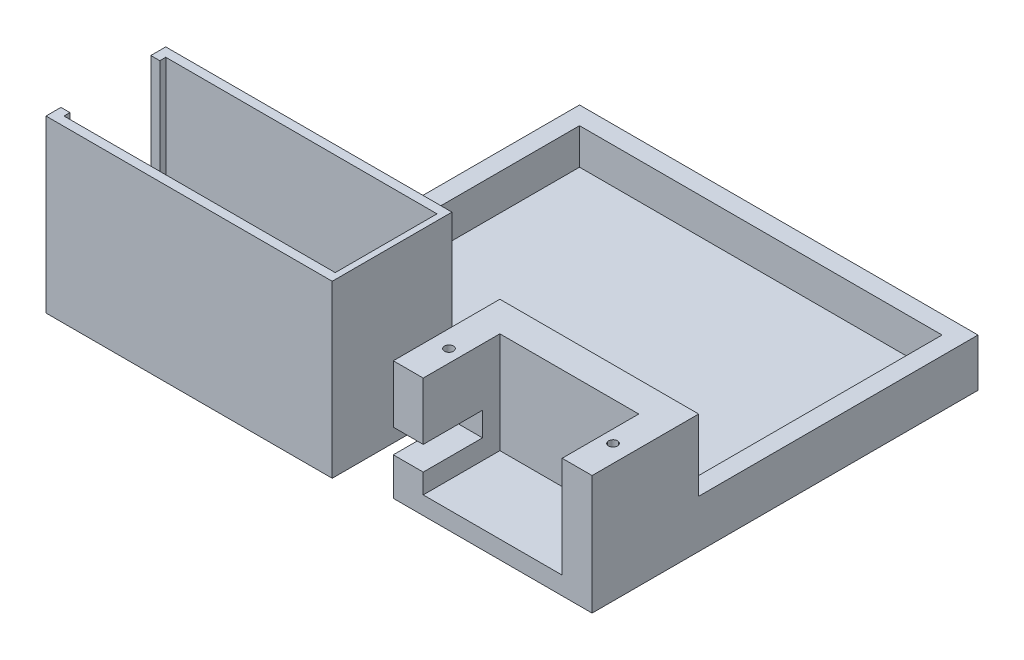
ISO-10303-21;
HEADER;
FILE_DESCRIPTION(('STEP AP214'),'2;1');
FILE_NAME('part.step','',(''),(''),'','','');
FILE_SCHEMA(('AUTOMOTIVE_DESIGN { 1 0 10303 214 1 1 1 1 }'));
ENDSEC;
DATA;
#1=APPLICATION_CONTEXT('core data for automotive mechanical design processes');
#2=APPLICATION_PROTOCOL_DEFINITION('international standard','automotive_design',2000,#1);
#3=PRODUCT_CONTEXT('',#1,'mechanical');
#4=PRODUCT('Part','Part','',(#3));
#5=PRODUCT_RELATED_PRODUCT_CATEGORY('part','',(#4));
#6=PRODUCT_DEFINITION_FORMATION('','',#4);
#7=PRODUCT_DEFINITION_CONTEXT('part definition',#1,'design');
#8=PRODUCT_DEFINITION('design','',#6,#7);
#9=PRODUCT_DEFINITION_SHAPE('','',#8);
#10=(LENGTH_UNIT() NAMED_UNIT(*) SI_UNIT(.MILLI.,.METRE.));
#11=(NAMED_UNIT(*) PLANE_ANGLE_UNIT() SI_UNIT($,.RADIAN.));
#12=(NAMED_UNIT(*) SI_UNIT($,.STERADIAN.) SOLID_ANGLE_UNIT());
#13=UNCERTAINTY_MEASURE_WITH_UNIT(LENGTH_MEASURE(1.E-05),#10,'distance_accuracy_value','');
#14=(GEOMETRIC_REPRESENTATION_CONTEXT(3) GLOBAL_UNCERTAINTY_ASSIGNED_CONTEXT((#13)) GLOBAL_UNIT_ASSIGNED_CONTEXT((#10,
#11,#12)) REPRESENTATION_CONTEXT('',''));
#15=CARTESIAN_POINT('',(0.,0.,0.));
#16=DIRECTION('',(0.,0.,1.));
#17=DIRECTION('',(1.,0.,0.));
#18=AXIS2_PLACEMENT_3D('',#15,#16,#17);
#19=CARTESIAN_POINT('',(-38.65,4.7,-17.5));
#20=DIRECTION('',(0.,0.,1.));
#21=DIRECTION('',(1.,0.,0.));
#22=AXIS2_PLACEMENT_3D('',#19,#20,#21);
#23=PLANE('',#22);
#24=DIRECTION('',(-1.,0.,0.));
#25=VECTOR('',#24,1.);
#26=CARTESIAN_POINT('',(-38.65,4.7,-17.5));
#27=LINE('',#26,#25);
#28=CARTESIAN_POINT('',(-5.3,4.70000000000002,-17.5));
#29=VERTEX_POINT('',#28);
#30=CARTESIAN_POINT('',(-13.3,4.7,-17.5));
#31=VERTEX_POINT('',#30);
#32=EDGE_CURVE('E494',#29,#31,#27,.T.);
#33=ORIENTED_EDGE('',*,*,#32,.T.);
#34=DIRECTION('',(0.,-1.,0.));
#35=VECTOR('',#34,1.);
#36=CARTESIAN_POINT('',(-13.3,25.2,-17.5));
#37=LINE('',#36,#35);
#38=CARTESIAN_POINT('',(-13.3,-3.3,-17.5));
#39=VERTEX_POINT('',#38);
#40=EDGE_CURVE('E56',#31,#39,#37,.T.);
#41=ORIENTED_EDGE('',*,*,#40,.T.);
#42=DIRECTION('',(-1.,0.,0.));
#43=VECTOR('',#42,1.);
#44=CARTESIAN_POINT('',(-38.65,-3.3,-17.5));
#45=LINE('',#44,#43);
#46=CARTESIAN_POINT('',(-5.3,-3.3,-17.5));
#47=VERTEX_POINT('',#46);
#48=EDGE_CURVE('E482',#47,#39,#45,.T.);
#49=ORIENTED_EDGE('',*,*,#48,.F.);
#50=DIRECTION('',(0.,-1.,0.));
#51=VECTOR('',#50,1.);
#52=CARTESIAN_POINT('',(-5.3,57.175054314054,-17.5));
#53=LINE('',#52,#51);
#54=EDGE_CURVE('E582',#29,#47,#53,.T.);
#55=ORIENTED_EDGE('',*,*,#54,.F.);
#56=EDGE_LOOP('',(#33,#41,#49,#55));
#57=FACE_BOUND('',#56,.T.);
#58=ADVANCED_FACE('F38',(#57),#23,.T.);
#59=CARTESIAN_POINT('',(-5.3,-3.301,0.3));
#60=DIRECTION('',(0.,0.,-1.));
#61=DIRECTION('',(-1.,0.,0.));
#62=AXIS2_PLACEMENT_3D('',#59,#60,#61);
#63=PLANE('',#62);
#64=DIRECTION('',(0.,-1.,0.));
#65=VECTOR('',#64,1.);
#66=CARTESIAN_POINT('',(-0.3,57.175054314054,0.3));
#67=LINE('',#66,#65);
#68=CARTESIAN_POINT('',(-0.300000000000002,3.,0.300000000000001));
#69=VERTEX_POINT('',#68);
#70=CARTESIAN_POINT('',(-0.3,-0.3,0.3));
#71=VERTEX_POINT('',#70);
#72=EDGE_CURVE('E561',#69,#71,#67,.T.);
#73=ORIENTED_EDGE('',*,*,#72,.F.);
#74=DIRECTION('',(-1.,0.,0.));
#75=VECTOR('',#74,1.);
#76=CARTESIAN_POINT('',(27.901,3.,0.3));
#77=LINE('',#76,#75);
#78=CARTESIAN_POINT('',(-5.3,3.,0.3));
#79=VERTEX_POINT('',#78);
#80=EDGE_CURVE('E263',#69,#79,#77,.T.);
#81=ORIENTED_EDGE('',*,*,#80,.T.);
#82=DIRECTION('',(0.,1.,0.));
#83=VECTOR('',#82,1.);
#84=CARTESIAN_POINT('',(-5.3,-3.301,0.3));
#85=LINE('',#84,#83);
#86=CARTESIAN_POINT('',(-5.3,-3.3,0.300000000000001));
#87=VERTEX_POINT('',#86);
#88=EDGE_CURVE('E410',#87,#79,#85,.T.);
#89=ORIENTED_EDGE('',*,*,#88,.F.);
#90=DIRECTION('',(-1.,0.,0.));
#91=VECTOR('',#90,1.);
#92=CARTESIAN_POINT('',(-5.3,-3.3,0.3));
#93=LINE('',#92,#91);
#94=CARTESIAN_POINT('',(27.9,-3.3,0.300000000000002));
#95=VERTEX_POINT('',#94);
#96=EDGE_CURVE('E399',#95,#87,#93,.T.);
#97=ORIENTED_EDGE('',*,*,#96,.F.);
#98=DIRECTION('',(0.,1.,0.));
#99=VECTOR('',#98,1.);
#100=CARTESIAN_POINT('',(27.9,-3.301,0.300000000000002));
#101=LINE('',#100,#99);
#102=CARTESIAN_POINT('',(27.9,16.6,0.300000000000002));
#103=VERTEX_POINT('',#102);
#104=EDGE_CURVE('E409',#95,#103,#101,.T.);
#105=ORIENTED_EDGE('',*,*,#104,.T.);
#106=DIRECTION('',(-1.,0.,0.));
#107=VECTOR('',#106,1.);
#108=CARTESIAN_POINT('',(-5.3,16.6,0.3));
#109=LINE('',#108,#107);
#110=CARTESIAN_POINT('',(22.9,16.6,0.300000000000001));
#111=VERTEX_POINT('',#110);
#112=EDGE_CURVE('E406',#103,#111,#109,.T.);
#113=ORIENTED_EDGE('',*,*,#112,.T.);
#114=DIRECTION('',(0.,-1.,0.));
#115=VECTOR('',#114,1.);
#116=CARTESIAN_POINT('',(22.9,57.175054314054,0.3));
#117=LINE('',#116,#115);
#118=CARTESIAN_POINT('',(22.9,-0.3,0.300000000000001));
#119=VERTEX_POINT('',#118);
#120=EDGE_CURVE('E552',#111,#119,#117,.T.);
#121=ORIENTED_EDGE('',*,*,#120,.T.);
#122=DIRECTION('',(-1.,0.,0.));
#123=VECTOR('',#122,1.);
#124=CARTESIAN_POINT('',(22.9,-0.3,0.3));
#125=LINE('',#124,#123);
#126=EDGE_CURVE('E547',#119,#71,#125,.T.);
#127=ORIENTED_EDGE('',*,*,#126,.T.);
#128=EDGE_LOOP('',(#73,#81,#89,#97,#105,#113,#121,#127));
#129=FACE_BOUND('',#128,.T.);
#130=ADVANCED_FACE('F613',(#129),#63,.F.);
#131=CARTESIAN_POINT('',(27.9,57.175054314054,-17.5));
#132=DIRECTION('',(0.,0.,-1.));
#133=DIRECTION('',(-1.,0.,0.));
#134=AXIS2_PLACEMENT_3D('',#131,#132,#133);
#135=PLANE('',#134);
#136=DIRECTION('',(0.,-1.,0.));
#137=VECTOR('',#136,1.);
#138=CARTESIAN_POINT('',(27.9,57.175054314054,-17.5));
#139=LINE('',#138,#137);
#140=CARTESIAN_POINT('',(27.9,16.6,-17.5));
#141=VERTEX_POINT('',#140);
#142=CARTESIAN_POINT('',(27.9,4.7,-17.5));
#143=VERTEX_POINT('',#142);
#144=EDGE_CURVE('E578',#141,#143,#139,.T.);
#145=ORIENTED_EDGE('',*,*,#144,.T.);
#146=EDGE_CURVE('E489',#143,#29,#27,.T.);
#147=ORIENTED_EDGE('',*,*,#146,.T.);
#148=CARTESIAN_POINT('',(-5.3,16.6,-17.5));
#149=VERTEX_POINT('',#148);
#150=EDGE_CURVE('E589',#149,#29,#53,.T.);
#151=ORIENTED_EDGE('',*,*,#150,.F.);
#152=DIRECTION('',(1.,0.,0.));
#153=VECTOR('',#152,1.);
#154=CARTESIAN_POINT('',(27.9,16.6,-17.5));
#155=LINE('',#154,#153);
#156=EDGE_CURVE('E574',#149,#141,#155,.T.);
#157=ORIENTED_EDGE('',*,*,#156,.T.);
#158=EDGE_LOOP('',(#145,#147,#151,#157));
#159=FACE_BOUND('',#158,.T.);
#160=ADVANCED_FACE('F642',(#159),#135,.T.);
#161=CARTESIAN_POINT('',(27.9,57.175054314054,-17.5));
#162=DIRECTION('',(1.,0.,0.));
#163=DIRECTION('',(0.,0.,-1.));
#164=AXIS2_PLACEMENT_3D('',#161,#162,#163);
#165=PLANE('',#164);
#166=ORIENTED_EDGE('',*,*,#104,.F.);
#167=DIRECTION('',(0.,0.,1.));
#168=VECTOR('',#167,1.);
#169=CARTESIAN_POINT('',(27.9,-3.3,-17.5));
#170=LINE('',#169,#168);
#171=CARTESIAN_POINT('',(27.9,-3.3,-64.15));
#172=VERTEX_POINT('',#171);
#173=EDGE_CURVE('E539',#172,#95,#170,.T.);
#174=ORIENTED_EDGE('',*,*,#173,.F.);
#175=DIRECTION('',(0.,-1.,0.));
#176=VECTOR('',#175,1.);
#177=CARTESIAN_POINT('',(27.9,4.7,-64.15));
#178=LINE('',#177,#176);
#179=CARTESIAN_POINT('',(27.9,4.7,-64.15));
#180=VERTEX_POINT('',#179);
#181=EDGE_CURVE('E506',#180,#172,#178,.T.);
#182=ORIENTED_EDGE('',*,*,#181,.F.);
#183=DIRECTION('',(0.,0.,1.));
#184=VECTOR('',#183,1.);
#185=CARTESIAN_POINT('',(27.9,4.7,-17.5));
#186=LINE('',#185,#184);
#187=EDGE_CURVE('E486',#180,#143,#186,.T.);
#188=ORIENTED_EDGE('',*,*,#187,.T.);
#189=ORIENTED_EDGE('',*,*,#144,.F.);
#190=DIRECTION('',(0.,0.,1.));
#191=VECTOR('',#190,1.);
#192=CARTESIAN_POINT('',(27.9,16.6,-17.5));
#193=LINE('',#192,#191);
#194=EDGE_CURVE('E546',#141,#103,#193,.T.);
#195=ORIENTED_EDGE('',*,*,#194,.T.);
#196=EDGE_LOOP('',(#166,#174,#182,#188,#189,#195));
#197=FACE_BOUND('',#196,.T.);
#198=ADVANCED_FACE('F649',(#197),#165,.T.);
#199=CARTESIAN_POINT('',(-5.3,57.175054314054,-17.5));
#200=DIRECTION('',(-1.,0.,0.));
#201=DIRECTION('',(0.,0.,1.));
#202=AXIS2_PLACEMENT_3D('',#199,#200,#201);
#203=PLANE('',#202);
#204=ORIENTED_EDGE('',*,*,#88,.T.);
#205=DIRECTION('',(0.,0.,1.));
#206=VECTOR('',#205,1.);
#207=CARTESIAN_POINT('',(-5.3,3.,-9.6));
#208=LINE('',#207,#206);
#209=CARTESIAN_POINT('',(-5.3,3.,-9.6));
#210=VERTEX_POINT('',#209);
#211=EDGE_CURVE('E520',#210,#79,#208,.T.);
#212=ORIENTED_EDGE('',*,*,#211,.F.);
#213=DIRECTION('',(0.,-1.,0.));
#214=VECTOR('',#213,1.);
#215=CARTESIAN_POINT('',(-5.3,7.,-9.6));
#216=LINE('',#215,#214);
#217=CARTESIAN_POINT('',(-5.3,7.,-9.6));
#218=VERTEX_POINT('',#217);
#219=EDGE_CURVE('E524',#218,#210,#216,.T.);
#220=ORIENTED_EDGE('',*,*,#219,.F.);
#221=DIRECTION('',(0.,0.,1.));
#222=VECTOR('',#221,1.);
#223=CARTESIAN_POINT('',(-5.3,7.,-9.6));
#224=LINE('',#223,#222);
#225=CARTESIAN_POINT('',(-5.3,7.,0.3));
#226=VERTEX_POINT('',#225);
#227=EDGE_CURVE('E515',#218,#226,#224,.T.);
#228=ORIENTED_EDGE('',*,*,#227,.T.);
#229=CARTESIAN_POINT('',(-5.3,16.6,0.3));
#230=VERTEX_POINT('',#229);
#231=EDGE_CURVE('E415',#226,#230,#85,.T.);
#232=ORIENTED_EDGE('',*,*,#231,.T.);
#233=DIRECTION('',(0.,0.,-1.));
#234=VECTOR('',#233,1.);
#235=CARTESIAN_POINT('',(-5.3,16.6,-17.5));
#236=LINE('',#235,#234);
#237=EDGE_CURVE('E579',#230,#149,#236,.T.);
#238=ORIENTED_EDGE('',*,*,#237,.T.);
#239=ORIENTED_EDGE('',*,*,#150,.T.);
#240=ORIENTED_EDGE('',*,*,#54,.T.);
#241=DIRECTION('',(0.,0.,-1.));
#242=VECTOR('',#241,1.);
#243=CARTESIAN_POINT('',(-5.3,-3.3,5.3));
#244=LINE('',#243,#242);
#245=EDGE_CURVE('E543',#87,#47,#244,.T.);
#246=ORIENTED_EDGE('',*,*,#245,.F.);
#247=EDGE_LOOP('',(#204,#212,#220,#228,#232,#238,#239,#240,#246));
#248=FACE_BOUND('',#247,.T.);
#249=ADVANCED_FACE('F633',(#248),#203,.T.);
#250=CARTESIAN_POINT('',(22.9,57.175054314054,-12.5));
#251=DIRECTION('',(1.,0.,0.));
#252=DIRECTION('',(0.,0.,-1.));
#253=AXIS2_PLACEMENT_3D('',#250,#251,#252);
#254=PLANE('',#253);
#255=DIRECTION('',(0.,0.,1.));
#256=VECTOR('',#255,1.);
#257=CARTESIAN_POINT('',(22.9,16.6,-12.5));
#258=LINE('',#257,#256);
#259=CARTESIAN_POINT('',(22.9,16.6,-12.5));
#260=VERTEX_POINT('',#259);
#261=EDGE_CURVE('E566',#260,#111,#258,.T.);
#262=ORIENTED_EDGE('',*,*,#261,.F.);
#263=DIRECTION('',(0.,-1.,0.));
#264=VECTOR('',#263,1.);
#265=CARTESIAN_POINT('',(22.9,57.175054314054,-12.5));
#266=LINE('',#265,#264);
#267=CARTESIAN_POINT('',(22.9,-0.3,-12.5));
#268=VERTEX_POINT('',#267);
#269=EDGE_CURVE('E551',#260,#268,#266,.T.);
#270=ORIENTED_EDGE('',*,*,#269,.T.);
#271=DIRECTION('',(0.,0.,1.));
#272=VECTOR('',#271,1.);
#273=CARTESIAN_POINT('',(22.9,-0.3,-12.5));
#274=LINE('',#273,#272);
#275=EDGE_CURVE('E553',#268,#119,#274,.T.);
#276=ORIENTED_EDGE('',*,*,#275,.T.);
#277=ORIENTED_EDGE('',*,*,#120,.F.);
#278=EDGE_LOOP('',(#262,#270,#276,#277));
#279=FACE_BOUND('',#278,.T.);
#280=ADVANCED_FACE('F601',(#279),#254,.F.);
#281=CARTESIAN_POINT('',(22.9,57.175054314054,-12.5));
#282=DIRECTION('',(0.,0.,-1.));
#283=DIRECTION('',(-1.,0.,0.));
#284=AXIS2_PLACEMENT_3D('',#281,#282,#283);
#285=PLANE('',#284);
#286=DIRECTION('',(1.,0.,0.));
#287=VECTOR('',#286,1.);
#288=CARTESIAN_POINT('',(22.9,16.6,-12.5));
#289=LINE('',#288,#287);
#290=CARTESIAN_POINT('',(-0.3,16.6,-12.5));
#291=VERTEX_POINT('',#290);
#292=EDGE_CURVE('E11',#291,#260,#289,.T.);
#293=ORIENTED_EDGE('',*,*,#292,.F.);
#294=DIRECTION('',(0.,-1.,0.));
#295=VECTOR('',#294,1.);
#296=CARTESIAN_POINT('',(-0.3,57.175054314054,-12.5));
#297=LINE('',#296,#295);
#298=CARTESIAN_POINT('',(-0.3,-0.3,-12.5));
#299=VERTEX_POINT('',#298);
#300=EDGE_CURVE('E42',#291,#299,#297,.T.);
#301=ORIENTED_EDGE('',*,*,#300,.T.);
#302=DIRECTION('',(1.,0.,0.));
#303=VECTOR('',#302,1.);
#304=CARTESIAN_POINT('',(22.9,-0.3,-12.5));
#305=LINE('',#304,#303);
#306=EDGE_CURVE('E557',#299,#268,#305,.T.);
#307=ORIENTED_EDGE('',*,*,#306,.T.);
#308=ORIENTED_EDGE('',*,*,#269,.F.);
#309=EDGE_LOOP('',(#293,#301,#307,#308));
#310=FACE_BOUND('',#309,.T.);
#311=ADVANCED_FACE('F606',(#310),#285,.F.);
#312=CARTESIAN_POINT('',(-0.3,57.175054314054,-12.5));
#313=DIRECTION('',(-1.,0.,0.));
#314=DIRECTION('',(0.,0.,1.));
#315=AXIS2_PLACEMENT_3D('',#312,#313,#314);
#316=PLANE('',#315);
#317=DIRECTION('',(0.,0.,-1.));
#318=VECTOR('',#317,1.);
#319=CARTESIAN_POINT('',(-0.300000000000002,3.,-9.6));
#320=LINE('',#319,#318);
#321=CARTESIAN_POINT('',(-0.3,3.,-9.6));
#322=VERTEX_POINT('',#321);
#323=EDGE_CURVE('E505',#69,#322,#320,.T.);
#324=ORIENTED_EDGE('',*,*,#323,.F.);
#325=ORIENTED_EDGE('',*,*,#72,.T.);
#326=DIRECTION('',(0.,0.,-1.));
#327=VECTOR('',#326,1.);
#328=CARTESIAN_POINT('',(-0.3,-0.3,-12.5));
#329=LINE('',#328,#327);
#330=EDGE_CURVE('E562',#71,#299,#329,.T.);
#331=ORIENTED_EDGE('',*,*,#330,.T.);
#332=ORIENTED_EDGE('',*,*,#300,.F.);
#333=DIRECTION('',(0.,0.,-1.));
#334=VECTOR('',#333,1.);
#335=CARTESIAN_POINT('',(-0.3,16.6,-12.5));
#336=LINE('',#335,#334);
#337=CARTESIAN_POINT('',(-0.3,16.6,0.3));
#338=VERTEX_POINT('',#337);
#339=EDGE_CURVE('E48',#338,#291,#336,.T.);
#340=ORIENTED_EDGE('',*,*,#339,.F.);
#341=CARTESIAN_POINT('',(-0.3,7.00000000000001,0.3));
#342=VERTEX_POINT('',#341);
#343=EDGE_CURVE('E567',#338,#342,#67,.T.);
#344=ORIENTED_EDGE('',*,*,#343,.T.);
#345=DIRECTION('',(0.,0.,-1.));
#346=VECTOR('',#345,1.);
#347=CARTESIAN_POINT('',(-0.300000000000002,7.,-9.6));
#348=LINE('',#347,#346);
#349=CARTESIAN_POINT('',(-0.300000000000002,7.,-9.6));
#350=VERTEX_POINT('',#349);
#351=EDGE_CURVE('E523',#342,#350,#348,.T.);
#352=ORIENTED_EDGE('',*,*,#351,.T.);
#353=DIRECTION('',(0.,1.,0.));
#354=VECTOR('',#353,1.);
#355=CARTESIAN_POINT('',(-0.300000000000002,7.,-9.6));
#356=LINE('',#355,#354);
#357=EDGE_CURVE('E514',#322,#350,#356,.T.);
#358=ORIENTED_EDGE('',*,*,#357,.F.);
#359=EDGE_LOOP('',(#324,#325,#331,#332,#340,#344,#352,#358));
#360=FACE_BOUND('',#359,.T.);
#361=ADVANCED_FACE('F622',(#360),#316,.F.);
#362=CARTESIAN_POINT('',(0.,16.6,0.));
#363=DIRECTION('',(0.,1.,0.));
#364=DIRECTION('',(0.,0.,1.));
#365=AXIS2_PLACEMENT_3D('',#362,#363,#364);
#366=PLANE('',#365);
#367=ORIENTED_EDGE('',*,*,#112,.F.);
#368=ORIENTED_EDGE('',*,*,#194,.F.);
#369=ORIENTED_EDGE('',*,*,#156,.F.);
#370=ORIENTED_EDGE('',*,*,#237,.F.);
#371=EDGE_CURVE('E405',#338,#230,#109,.T.);
#372=ORIENTED_EDGE('',*,*,#371,.F.);
#373=ORIENTED_EDGE('',*,*,#339,.T.);
#374=ORIENTED_EDGE('',*,*,#292,.T.);
#375=ORIENTED_EDGE('',*,*,#261,.T.);
#376=EDGE_LOOP('',(#367,#368,#369,#370,#372,#373,#374,#375));
#377=FACE_BOUND('',#376,.T.);
#378=CARTESIAN_POINT('',(-2.4,16.6,-6.1));
#379=DIRECTION('',(0.,1.,0.));
#380=DIRECTION('',(0.,0.,1.));
#381=AXIS2_PLACEMENT_3D('',#378,#379,#380);
#382=CIRCLE('',#381,0.75);
#383=CARTESIAN_POINT('',(-2.4,16.6,-5.35));
#384=VERTEX_POINT('',#383);
#385=EDGE_CURVE('E423',#384,#384,#382,.T.);
#386=ORIENTED_EDGE('',*,*,#385,.F.);
#387=EDGE_LOOP('',(#386));
#388=FACE_BOUND('',#387,.T.);
#389=CARTESIAN_POINT('',(25.,16.6,-6.1));
#390=DIRECTION('',(0.,1.,0.));
#391=DIRECTION('',(0.,0.,1.));
#392=AXIS2_PLACEMENT_3D('',#389,#390,#391);
#393=CIRCLE('',#392,0.750000000000002);
#394=CARTESIAN_POINT('',(25.,16.6,-5.35));
#395=VERTEX_POINT('',#394);
#396=EDGE_CURVE('E414',#395,#395,#393,.T.);
#397=ORIENTED_EDGE('',*,*,#396,.F.);
#398=EDGE_LOOP('',(#397));
#399=FACE_BOUND('',#398,.T.);
#400=ADVANCED_FACE('F40',(#377,#388,#399),#366,.T.);
#401=CARTESIAN_POINT('',(0.,-0.3,0.));
#402=DIRECTION('',(0.,-1.,0.));
#403=DIRECTION('',(0.,0.,-1.));
#404=AXIS2_PLACEMENT_3D('',#401,#402,#403);
#405=PLANE('',#404);
#406=ORIENTED_EDGE('',*,*,#126,.F.);
#407=ORIENTED_EDGE('',*,*,#275,.F.);
#408=ORIENTED_EDGE('',*,*,#306,.F.);
#409=ORIENTED_EDGE('',*,*,#330,.F.);
#410=EDGE_LOOP('',(#406,#407,#408,#409));
#411=FACE_BOUND('',#410,.T.);
#412=ADVANCED_FACE('F610',(#411),#405,.F.);
#413=CARTESIAN_POINT('',(0.,-3.3,0.));
#414=DIRECTION('',(0.,-1.,0.));
#415=DIRECTION('',(0.,0.,-1.));
#416=AXIS2_PLACEMENT_3D('',#413,#414,#415);
#417=PLANE('',#416);
#418=ORIENTED_EDGE('',*,*,#96,.T.);
#419=ORIENTED_EDGE('',*,*,#245,.T.);
#420=ORIENTED_EDGE('',*,*,#48,.T.);
#421=DIRECTION('',(0.,0.,1.));
#422=VECTOR('',#421,1.);
#423=CARTESIAN_POINT('',(-13.3,-3.3,-17.5));
#424=LINE('',#423,#422);
#425=CARTESIAN_POINT('',(-13.3,-3.3,2.50000000000001));
#426=VERTEX_POINT('',#425);
#427=EDGE_CURVE('E377',#39,#426,#424,.T.);
#428=ORIENTED_EDGE('',*,*,#427,.T.);
#429=DIRECTION('',(1.,0.,0.));
#430=VECTOR('',#429,1.);
#431=CARTESIAN_POINT('',(-53.3,-3.3,2.50000000000001));
#432=LINE('',#431,#430);
#433=CARTESIAN_POINT('',(-61.1,-3.3,2.50000000000001));
#434=VERTEX_POINT('',#433);
#435=EDGE_CURVE('E264',#434,#426,#432,.T.);
#436=ORIENTED_EDGE('',*,*,#435,.F.);
#437=DIRECTION('',(0.,0.,1.));
#438=VECTOR('',#437,1.);
#439=CARTESIAN_POINT('',(-61.1,-3.3,-17.5));
#440=LINE('',#439,#438);
#441=CARTESIAN_POINT('',(-61.1,-3.3,-17.5));
#442=VERTEX_POINT('',#441);
#443=EDGE_CURVE('E267',#442,#434,#440,.T.);
#444=ORIENTED_EDGE('',*,*,#443,.F.);
#445=DIRECTION('',(1.,0.,0.));
#446=VECTOR('',#445,1.);
#447=CARTESIAN_POINT('',(-53.3,-3.3,-17.5));
#448=LINE('',#447,#446);
#449=CARTESIAN_POINT('',(-38.65,-3.3,-17.5));
#450=VERTEX_POINT('',#449);
#451=EDGE_CURVE('E252',#442,#450,#448,.T.);
#452=ORIENTED_EDGE('',*,*,#451,.T.);
#453=DIRECTION('',(0.,0.,-1.));
#454=VECTOR('',#453,1.);
#455=CARTESIAN_POINT('',(-38.65,-3.3,-17.5));
#456=LINE('',#455,#454);
#457=CARTESIAN_POINT('',(-38.65,-3.3,-64.15));
#458=VERTEX_POINT('',#457);
#459=EDGE_CURVE('E467',#450,#458,#456,.T.);
#460=ORIENTED_EDGE('',*,*,#459,.T.);
#461=DIRECTION('',(1.,0.,0.));
#462=VECTOR('',#461,1.);
#463=CARTESIAN_POINT('',(-38.65,-3.3,-64.15));
#464=LINE('',#463,#462);
#465=EDGE_CURVE('E497',#458,#172,#464,.T.);
#466=ORIENTED_EDGE('',*,*,#465,.T.);
#467=ORIENTED_EDGE('',*,*,#173,.T.);
#468=EDGE_LOOP('',(#418,#419,#420,#428,#436,#444,#452,#460,#466,#467));
#469=FACE_BOUND('',#468,.T.);
#470=ADVANCED_FACE('F269',(#469),#417,.T.);
#471=CARTESIAN_POINT('',(27.901,3.,-9.6));
#472=DIRECTION('',(0.,-1.,0.));
#473=DIRECTION('',(0.,0.,-1.));
#474=AXIS2_PLACEMENT_3D('',#471,#472,#473);
#475=PLANE('',#474);
#476=ORIENTED_EDGE('',*,*,#323,.T.);
#477=DIRECTION('',(-1.,0.,0.));
#478=VECTOR('',#477,1.);
#479=CARTESIAN_POINT('',(27.901,3.,-9.6));
#480=LINE('',#479,#478);
#481=EDGE_CURVE('E518',#322,#210,#480,.T.);
#482=ORIENTED_EDGE('',*,*,#481,.T.);
#483=ORIENTED_EDGE('',*,*,#211,.T.);
#484=ORIENTED_EDGE('',*,*,#80,.F.);
#485=EDGE_LOOP('',(#476,#482,#483,#484));
#486=FACE_BOUND('',#485,.T.);
#487=ADVANCED_FACE('F629',(#486),#475,.F.);
#488=CARTESIAN_POINT('',(27.901,7.,-9.6));
#489=DIRECTION('',(0.,-1.,0.));
#490=DIRECTION('',(0.,0.,-1.));
#491=AXIS2_PLACEMENT_3D('',#488,#489,#490);
#492=PLANE('',#491);
#493=ORIENTED_EDGE('',*,*,#351,.F.);
#494=DIRECTION('',(-1.,0.,0.));
#495=VECTOR('',#494,1.);
#496=CARTESIAN_POINT('',(27.901,7.,0.299999999999999));
#497=LINE('',#496,#495);
#498=EDGE_CURVE('E395',#342,#226,#497,.T.);
#499=ORIENTED_EDGE('',*,*,#498,.T.);
#500=ORIENTED_EDGE('',*,*,#227,.F.);
#501=DIRECTION('',(-1.,0.,0.));
#502=VECTOR('',#501,1.);
#503=CARTESIAN_POINT('',(27.901,7.,-9.6));
#504=LINE('',#503,#502);
#505=EDGE_CURVE('E519',#350,#218,#504,.T.);
#506=ORIENTED_EDGE('',*,*,#505,.F.);
#507=EDGE_LOOP('',(#493,#499,#500,#506));
#508=FACE_BOUND('',#507,.T.);
#509=ADVANCED_FACE('F667',(#508),#492,.T.);
#510=CARTESIAN_POINT('',(27.901,7.,-9.6));
#511=DIRECTION('',(0.,0.,-1.));
#512=DIRECTION('',(-1.,0.,0.));
#513=AXIS2_PLACEMENT_3D('',#510,#511,#512);
#514=PLANE('',#513);
#515=ORIENTED_EDGE('',*,*,#357,.T.);
#516=ORIENTED_EDGE('',*,*,#505,.T.);
#517=ORIENTED_EDGE('',*,*,#219,.T.);
#518=ORIENTED_EDGE('',*,*,#481,.F.);
#519=EDGE_LOOP('',(#515,#516,#517,#518));
#520=FACE_BOUND('',#519,.T.);
#521=ADVANCED_FACE('F669',(#520),#514,.F.);
#522=CARTESIAN_POINT('',(-38.65,4.7,-17.5));
#523=DIRECTION('',(-1.,0.,0.));
#524=DIRECTION('',(0.,0.,1.));
#525=AXIS2_PLACEMENT_3D('',#522,#523,#524);
#526=PLANE('',#525);
#527=ORIENTED_EDGE('',*,*,#459,.F.);
#528=DIRECTION('',(0.,-1.,0.));
#529=VECTOR('',#528,1.);
#530=CARTESIAN_POINT('',(-38.65,4.7,-17.5));
#531=LINE('',#530,#529);
#532=CARTESIAN_POINT('',(-38.65,4.7,-17.5));
#533=VERTEX_POINT('',#532);
#534=EDGE_CURVE('E259',#533,#450,#531,.T.);
#535=ORIENTED_EDGE('',*,*,#534,.F.);
#536=DIRECTION('',(0.,0.,-1.));
#537=VECTOR('',#536,1.);
#538=CARTESIAN_POINT('',(-38.65,4.7,-17.5));
#539=LINE('',#538,#537);
#540=CARTESIAN_POINT('',(-38.65,4.7,-64.15));
#541=VERTEX_POINT('',#540);
#542=EDGE_CURVE('E477',#533,#541,#539,.T.);
#543=ORIENTED_EDGE('',*,*,#542,.T.);
#544=DIRECTION('',(0.,-1.,0.));
#545=VECTOR('',#544,1.);
#546=CARTESIAN_POINT('',(-38.65,4.7,-64.15));
#547=LINE('',#546,#545);
#548=EDGE_CURVE('E493',#541,#458,#547,.T.);
#549=ORIENTED_EDGE('',*,*,#548,.T.);
#550=EDGE_LOOP('',(#527,#535,#543,#549));
#551=FACE_BOUND('',#550,.T.);
#552=ADVANCED_FACE('F656',(#551),#526,.T.);
#553=CARTESIAN_POINT('',(-38.65,4.7,-64.15));
#554=DIRECTION('',(0.,0.,-1.));
#555=DIRECTION('',(-1.,0.,0.));
#556=AXIS2_PLACEMENT_3D('',#553,#554,#555);
#557=PLANE('',#556);
#558=ORIENTED_EDGE('',*,*,#465,.F.);
#559=ORIENTED_EDGE('',*,*,#548,.F.);
#560=DIRECTION('',(1.,0.,0.));
#561=VECTOR('',#560,1.);
#562=CARTESIAN_POINT('',(-38.65,4.7,-64.15));
#563=LINE('',#562,#561);
#564=EDGE_CURVE('E481',#541,#180,#563,.T.);
#565=ORIENTED_EDGE('',*,*,#564,.T.);
#566=ORIENTED_EDGE('',*,*,#181,.T.);
#567=EDGE_LOOP('',(#558,#559,#565,#566));
#568=FACE_BOUND('',#567,.T.);
#569=ADVANCED_FACE('F654',(#568),#557,.T.);
#570=CARTESIAN_POINT('',(0.,4.7,0.));
#571=DIRECTION('',(0.,-1.,0.));
#572=DIRECTION('',(0.,0.,-1.));
#573=AXIS2_PLACEMENT_3D('',#570,#571,#572);
#574=PLANE('',#573);
#575=DIRECTION('',(-1.,0.,0.));
#576=VECTOR('',#575,1.);
#577=CARTESIAN_POINT('',(24.9,4.7,-61.15));
#578=LINE('',#577,#576);
#579=CARTESIAN_POINT('',(24.9,4.7,-61.15));
#580=VERTEX_POINT('',#579);
#581=CARTESIAN_POINT('',(-35.65,4.7,-61.15));
#582=VERTEX_POINT('',#581);
#583=EDGE_CURVE('E453',#580,#582,#578,.T.);
#584=ORIENTED_EDGE('',*,*,#583,.F.);
#585=DIRECTION('',(0.,0.,-1.));
#586=VECTOR('',#585,1.);
#587=CARTESIAN_POINT('',(24.9,4.7,-20.5));
#588=LINE('',#587,#586);
#589=CARTESIAN_POINT('',(24.9,4.7,-20.5));
#590=VERTEX_POINT('',#589);
#591=EDGE_CURVE('E422',#590,#580,#588,.T.);
#592=ORIENTED_EDGE('',*,*,#591,.F.);
#593=DIRECTION('',(1.,0.,0.));
#594=VECTOR('',#593,1.);
#595=CARTESIAN_POINT('',(-5.3,4.7,-20.5));
#596=LINE('',#595,#594);
#597=CARTESIAN_POINT('',(-35.65,4.7,-20.5));
#598=VERTEX_POINT('',#597);
#599=EDGE_CURVE('E439',#598,#590,#596,.T.);
#600=ORIENTED_EDGE('',*,*,#599,.F.);
#601=DIRECTION('',(0.,0.,1.));
#602=VECTOR('',#601,1.);
#603=CARTESIAN_POINT('',(-35.65,4.7,-61.15));
#604=LINE('',#603,#602);
#605=EDGE_CURVE('E457',#582,#598,#604,.T.);
#606=ORIENTED_EDGE('',*,*,#605,.F.);
#607=EDGE_LOOP('',(#584,#592,#600,#606));
#608=FACE_BOUND('',#607,.T.);
#609=ORIENTED_EDGE('',*,*,#542,.F.);
#610=EDGE_CURVE('E64',#31,#533,#27,.T.);
#611=ORIENTED_EDGE('',*,*,#610,.F.);
#612=ORIENTED_EDGE('',*,*,#32,.F.);
#613=ORIENTED_EDGE('',*,*,#146,.F.);
#614=ORIENTED_EDGE('',*,*,#187,.F.);
#615=ORIENTED_EDGE('',*,*,#564,.F.);
#616=EDGE_LOOP('',(#609,#611,#612,#613,#614,#615));
#617=FACE_BOUND('',#616,.T.);
#618=ADVANCED_FACE('F651',(#608,#617),#574,.F.);
#619=CARTESIAN_POINT('',(24.9,-1.3,-20.5));
#620=DIRECTION('',(1.,0.,0.));
#621=DIRECTION('',(0.,0.,-1.));
#622=AXIS2_PLACEMENT_3D('',#619,#620,#621);
#623=PLANE('',#622);
#624=ORIENTED_EDGE('',*,*,#591,.T.);
#625=DIRECTION('',(0.,1.,0.));
#626=VECTOR('',#625,1.);
#627=CARTESIAN_POINT('',(24.9,-1.3,-61.15));
#628=LINE('',#627,#626);
#629=CARTESIAN_POINT('',(24.9,-1.3,-61.15));
#630=VERTEX_POINT('',#629);
#631=EDGE_CURVE('E450',#630,#580,#628,.T.);
#632=ORIENTED_EDGE('',*,*,#631,.F.);
#633=DIRECTION('',(0.,0.,-1.));
#634=VECTOR('',#633,1.);
#635=CARTESIAN_POINT('',(24.9,-1.3,-20.5));
#636=LINE('',#635,#634);
#637=CARTESIAN_POINT('',(24.9,-1.3,-20.5));
#638=VERTEX_POINT('',#637);
#639=EDGE_CURVE('E434',#638,#630,#636,.T.);
#640=ORIENTED_EDGE('',*,*,#639,.F.);
#641=DIRECTION('',(0.,1.,0.));
#642=VECTOR('',#641,1.);
#643=CARTESIAN_POINT('',(24.9,-1.3,-20.5));
#644=LINE('',#643,#642);
#645=EDGE_CURVE('E464',#638,#590,#644,.T.);
#646=ORIENTED_EDGE('',*,*,#645,.T.);
#647=EDGE_LOOP('',(#624,#632,#640,#646));
#648=FACE_BOUND('',#647,.T.);
#649=ADVANCED_FACE('F691',(#648),#623,.F.);
#650=CARTESIAN_POINT('',(-5.3,-1.3,-20.5));
#651=DIRECTION('',(0.,0.,1.));
#652=DIRECTION('',(1.,0.,0.));
#653=AXIS2_PLACEMENT_3D('',#650,#651,#652);
#654=PLANE('',#653);
#655=ORIENTED_EDGE('',*,*,#599,.T.);
#656=ORIENTED_EDGE('',*,*,#645,.F.);
#657=DIRECTION('',(1.,0.,0.));
#658=VECTOR('',#657,1.);
#659=CARTESIAN_POINT('',(-35.65,-1.3,-20.5));
#660=LINE('',#659,#658);
#661=CARTESIAN_POINT('',(-35.65,-1.3,-20.5));
#662=VERTEX_POINT('',#661);
#663=EDGE_CURVE('E447',#662,#638,#660,.T.);
#664=ORIENTED_EDGE('',*,*,#663,.F.);
#665=DIRECTION('',(0.,1.,0.));
#666=VECTOR('',#665,1.);
#667=CARTESIAN_POINT('',(-35.65,-1.3,-20.5));
#668=LINE('',#667,#666);
#669=EDGE_CURVE('E468',#662,#598,#668,.T.);
#670=ORIENTED_EDGE('',*,*,#669,.T.);
#671=EDGE_LOOP('',(#655,#656,#664,#670));
#672=FACE_BOUND('',#671,.T.);
#673=ADVANCED_FACE('F696',(#672),#654,.F.);
#674=CARTESIAN_POINT('',(-35.65,-1.3,-61.15));
#675=DIRECTION('',(-1.,0.,0.));
#676=DIRECTION('',(0.,0.,1.));
#677=AXIS2_PLACEMENT_3D('',#674,#675,#676);
#678=PLANE('',#677);
#679=ORIENTED_EDGE('',*,*,#605,.T.);
#680=ORIENTED_EDGE('',*,*,#669,.F.);
#681=DIRECTION('',(0.,0.,1.));
#682=VECTOR('',#681,1.);
#683=CARTESIAN_POINT('',(-35.65,-1.3,-61.15));
#684=LINE('',#683,#682);
#685=CARTESIAN_POINT('',(-35.65,-1.3,-61.15));
#686=VERTEX_POINT('',#685);
#687=EDGE_CURVE('E443',#686,#662,#684,.T.);
#688=ORIENTED_EDGE('',*,*,#687,.F.);
#689=DIRECTION('',(0.,1.,0.));
#690=VECTOR('',#689,1.);
#691=CARTESIAN_POINT('',(-35.65,-1.3,-61.15));
#692=LINE('',#691,#690);
#693=EDGE_CURVE('E471',#686,#582,#692,.T.);
#694=ORIENTED_EDGE('',*,*,#693,.T.);
#695=EDGE_LOOP('',(#679,#680,#688,#694));
#696=FACE_BOUND('',#695,.T.);
#697=ADVANCED_FACE('F711',(#696),#678,.F.);
#698=CARTESIAN_POINT('',(24.9,-1.3,-61.15));
#699=DIRECTION('',(0.,0.,-1.));
#700=DIRECTION('',(-1.,0.,0.));
#701=AXIS2_PLACEMENT_3D('',#698,#699,#700);
#702=PLANE('',#701);
#703=ORIENTED_EDGE('',*,*,#583,.T.);
#704=ORIENTED_EDGE('',*,*,#693,.F.);
#705=DIRECTION('',(-1.,0.,0.));
#706=VECTOR('',#705,1.);
#707=CARTESIAN_POINT('',(24.9,-1.3,-61.15));
#708=LINE('',#707,#706);
#709=EDGE_CURVE('E438',#630,#686,#708,.T.);
#710=ORIENTED_EDGE('',*,*,#709,.F.);
#711=ORIENTED_EDGE('',*,*,#631,.T.);
#712=EDGE_LOOP('',(#703,#704,#710,#711));
#713=FACE_BOUND('',#712,.T.);
#714=ADVANCED_FACE('F703',(#713),#702,.F.);
#715=CARTESIAN_POINT('',(0.,-1.3,0.));
#716=DIRECTION('',(0.,1.,0.));
#717=DIRECTION('',(0.,0.,1.));
#718=AXIS2_PLACEMENT_3D('',#715,#716,#717);
#719=PLANE('',#718);
#720=ORIENTED_EDGE('',*,*,#639,.T.);
#721=ORIENTED_EDGE('',*,*,#709,.T.);
#722=ORIENTED_EDGE('',*,*,#687,.T.);
#723=ORIENTED_EDGE('',*,*,#663,.T.);
#724=EDGE_LOOP('',(#720,#721,#722,#723));
#725=FACE_BOUND('',#724,.T.);
#726=ADVANCED_FACE('F713',(#725),#719,.T.);
#727=CARTESIAN_POINT('',(25.,8.6,-6.1));
#728=DIRECTION('',(0.,1.,0.));
#729=DIRECTION('',(0.,0.,1.));
#730=AXIS2_PLACEMENT_3D('',#727,#728,#729);
#731=CYLINDRICAL_SURFACE('',#730,0.750000000000002);
#732=CARTESIAN_POINT('',(25.,8.6,-6.1));
#733=DIRECTION('',(0.,1.,0.));
#734=DIRECTION('',(0.,0.,1.));
#735=AXIS2_PLACEMENT_3D('',#732,#733,#734);
#736=CIRCLE('',#735,0.750000000000002);
#737=CARTESIAN_POINT('',(25.,8.6,-5.35));
#738=VERTEX_POINT('',#737);
#739=EDGE_CURVE('E427',#738,#738,#736,.T.);
#740=ORIENTED_EDGE('',*,*,#739,.F.);
#741=EDGE_LOOP('',(#740));
#742=FACE_BOUND('',#741,.T.);
#743=ORIENTED_EDGE('',*,*,#396,.T.);
#744=EDGE_LOOP('',(#743));
#745=FACE_BOUND('',#744,.T.);
#746=ADVANCED_FACE('F715',(#742,#745),#731,.F.);
#747=CARTESIAN_POINT('',(25.,8.6,-6.1));
#748=DIRECTION('',(0.,1.,0.));
#749=DIRECTION('',(0.,0.,1.));
#750=AXIS2_PLACEMENT_3D('',#747,#748,#749);
#751=PLANE('',#750);
#752=ORIENTED_EDGE('',*,*,#739,.T.);
#753=EDGE_LOOP('',(#752));
#754=FACE_BOUND('',#753,.T.);
#755=ADVANCED_FACE('F721',(#754),#751,.T.);
#756=CARTESIAN_POINT('',(-2.4,8.6,-6.1));
#757=DIRECTION('',(0.,1.,0.));
#758=DIRECTION('',(0.,0.,1.));
#759=AXIS2_PLACEMENT_3D('',#756,#757,#758);
#760=CYLINDRICAL_SURFACE('',#759,0.75);
#761=CARTESIAN_POINT('',(-2.4,8.6,-6.1));
#762=DIRECTION('',(0.,1.,0.));
#763=DIRECTION('',(0.,0.,1.));
#764=AXIS2_PLACEMENT_3D('',#761,#762,#763);
#765=CIRCLE('',#764,0.75);
#766=CARTESIAN_POINT('',(-2.4,8.6,-5.35));
#767=VERTEX_POINT('',#766);
#768=EDGE_CURVE('E418',#767,#767,#765,.T.);
#769=ORIENTED_EDGE('',*,*,#768,.F.);
#770=EDGE_LOOP('',(#769));
#771=FACE_BOUND('',#770,.T.);
#772=ORIENTED_EDGE('',*,*,#385,.T.);
#773=EDGE_LOOP('',(#772));
#774=FACE_BOUND('',#773,.T.);
#775=ADVANCED_FACE('F759',(#771,#774),#760,.F.);
#776=CARTESIAN_POINT('',(-2.4,8.6,-6.1));
#777=DIRECTION('',(0.,1.,0.));
#778=DIRECTION('',(0.,0.,1.));
#779=AXIS2_PLACEMENT_3D('',#776,#777,#778);
#780=PLANE('',#779);
#781=ORIENTED_EDGE('',*,*,#768,.T.);
#782=EDGE_LOOP('',(#781));
#783=FACE_BOUND('',#782,.T.);
#784=ADVANCED_FACE('F768',(#783),#780,.T.);
#785=ORIENTED_EDGE('',*,*,#231,.F.);
#786=ORIENTED_EDGE('',*,*,#498,.F.);
#787=ORIENTED_EDGE('',*,*,#343,.F.);
#788=ORIENTED_EDGE('',*,*,#371,.T.);
#789=EDGE_LOOP('',(#785,#786,#787,#788));
#790=FACE_BOUND('',#789,.T.);
#791=ADVANCED_FACE('F664',(#790),#63,.F.);
#792=CARTESIAN_POINT('',(-53.3,25.2,-17.5));
#793=DIRECTION('',(0.,0.,1.));
#794=DIRECTION('',(0.,-1.,0.));
#795=AXIS2_PLACEMENT_3D('',#792,#793,#794);
#796=PLANE('',#795);
#797=ORIENTED_EDGE('',*,*,#534,.T.);
#798=ORIENTED_EDGE('',*,*,#451,.F.);
#799=DIRECTION('',(0.,-1.,0.));
#800=VECTOR('',#799,1.);
#801=CARTESIAN_POINT('',(-61.1,25.2,-17.5));
#802=LINE('',#801,#800);
#803=CARTESIAN_POINT('',(-61.1,25.2,-17.5));
#804=VERTEX_POINT('',#803);
#805=EDGE_CURVE('E257',#804,#442,#802,.T.);
#806=ORIENTED_EDGE('',*,*,#805,.F.);
#807=DIRECTION('',(1.,0.,0.));
#808=VECTOR('',#807,1.);
#809=CARTESIAN_POINT('',(-53.3,25.2,-17.5));
#810=LINE('',#809,#808);
#811=CARTESIAN_POINT('',(-13.3,25.2,-17.5));
#812=VERTEX_POINT('',#811);
#813=EDGE_CURVE('E386',#804,#812,#810,.T.);
#814=ORIENTED_EDGE('',*,*,#813,.T.);
#815=EDGE_CURVE('E373',#812,#31,#37,.T.);
#816=ORIENTED_EDGE('',*,*,#815,.T.);
#817=ORIENTED_EDGE('',*,*,#610,.T.);
#818=EDGE_LOOP('',(#797,#798,#806,#814,#816,#817));
#819=FACE_BOUND('',#818,.T.);
#820=ADVANCED_FACE('F254',(#819),#796,.F.);
#821=CARTESIAN_POINT('',(-53.3,25.2,2.5));
#822=DIRECTION('',(0.,0.,-1.));
#823=DIRECTION('',(0.,1.,0.));
#824=AXIS2_PLACEMENT_3D('',#821,#822,#823);
#825=PLANE('',#824);
#826=DIRECTION('',(0.,1.,0.));
#827=VECTOR('',#826,1.);
#828=CARTESIAN_POINT('',(-13.3,25.2,2.5));
#829=LINE('',#828,#827);
#830=CARTESIAN_POINT('',(-13.3,25.2,2.5));
#831=VERTEX_POINT('',#830);
#832=EDGE_CURVE('E380',#426,#831,#829,.T.);
#833=ORIENTED_EDGE('',*,*,#832,.T.);
#834=DIRECTION('',(1.,0.,0.));
#835=VECTOR('',#834,1.);
#836=CARTESIAN_POINT('',(-53.3,25.2,2.5));
#837=LINE('',#836,#835);
#838=CARTESIAN_POINT('',(-61.1,25.2,2.5));
#839=VERTEX_POINT('',#838);
#840=EDGE_CURVE('E389',#839,#831,#837,.T.);
#841=ORIENTED_EDGE('',*,*,#840,.F.);
#842=DIRECTION('',(0.,1.,0.));
#843=VECTOR('',#842,1.);
#844=CARTESIAN_POINT('',(-61.1,-3.3,2.50000000000001));
#845=LINE('',#844,#843);
#846=EDGE_CURVE('E275',#434,#839,#845,.T.);
#847=ORIENTED_EDGE('',*,*,#846,.F.);
#848=ORIENTED_EDGE('',*,*,#435,.T.);
#849=EDGE_LOOP('',(#833,#841,#847,#848));
#850=FACE_BOUND('',#849,.T.);
#851=ADVANCED_FACE('F795',(#850),#825,.F.);
#852=CARTESIAN_POINT('',(-53.3,25.2,-17.5));
#853=DIRECTION('',(0.,-1.,0.));
#854=DIRECTION('',(0.,0.,-1.));
#855=AXIS2_PLACEMENT_3D('',#852,#853,#854);
#856=PLANE('',#855);
#857=ORIENTED_EDGE('',*,*,#813,.F.);
#858=DIRECTION('',(0.,0.,-1.));
#859=VECTOR('',#858,1.);
#860=CARTESIAN_POINT('',(-61.1,25.2,-15.));
#861=LINE('',#860,#859);
#862=CARTESIAN_POINT('',(-61.1,25.2,-15.));
#863=VERTEX_POINT('',#862);
#864=EDGE_CURVE('E280',#863,#804,#861,.T.);
#865=ORIENTED_EDGE('',*,*,#864,.F.);
#866=DIRECTION('',(1.,0.,0.));
#867=VECTOR('',#866,1.);
#868=CARTESIAN_POINT('',(-61.1,25.2,-15.));
#869=LINE('',#868,#867);
#870=CARTESIAN_POINT('',(-59.6,25.2,-15.));
#871=VERTEX_POINT('',#870);
#872=EDGE_CURVE('E305',#863,#871,#869,.T.);
#873=ORIENTED_EDGE('',*,*,#872,.T.);
#874=DIRECTION('',(0.,0.,-1.));
#875=VECTOR('',#874,1.);
#876=CARTESIAN_POINT('',(-59.6,25.2,-15.));
#877=LINE('',#876,#875);
#878=CARTESIAN_POINT('',(-59.6,25.2,-16.));
#879=VERTEX_POINT('',#878);
#880=EDGE_CURVE('E282',#871,#879,#877,.T.);
#881=ORIENTED_EDGE('',*,*,#880,.T.);
#882=DIRECTION('',(-1.,0.,0.));
#883=VECTOR('',#882,1.);
#884=CARTESIAN_POINT('',(-14.3,25.2,-16.));
#885=LINE('',#884,#883);
#886=CARTESIAN_POINT('',(-14.3,25.2,-16.));
#887=VERTEX_POINT('',#886);
#888=EDGE_CURVE('E361',#887,#879,#885,.T.);
#889=ORIENTED_EDGE('',*,*,#888,.F.);
#890=DIRECTION('',(0.,0.,-1.));
#891=VECTOR('',#890,1.);
#892=CARTESIAN_POINT('',(-14.3,25.2,-16.));
#893=LINE('',#892,#891);
#894=CARTESIAN_POINT('',(-14.3,25.2,1.00000000000001));
#895=VERTEX_POINT('',#894);
#896=EDGE_CURVE('E356',#895,#887,#893,.T.);
#897=ORIENTED_EDGE('',*,*,#896,.F.);
#898=DIRECTION('',(-1.,0.,0.));
#899=VECTOR('',#898,1.);
#900=CARTESIAN_POINT('',(-14.3,25.2,1.00000000000001));
#901=LINE('',#900,#899);
#902=CARTESIAN_POINT('',(-59.6,25.2,1.00000000000001));
#903=VERTEX_POINT('',#902);
#904=EDGE_CURVE('E364',#895,#903,#901,.T.);
#905=ORIENTED_EDGE('',*,*,#904,.T.);
#906=DIRECTION('',(0.,0.,-1.));
#907=VECTOR('',#906,1.);
#908=CARTESIAN_POINT('',(-59.6,25.2,2.5));
#909=LINE('',#908,#907);
#910=CARTESIAN_POINT('',(-59.6,25.2,0.));
#911=VERTEX_POINT('',#910);
#912=EDGE_CURVE('E306',#903,#911,#909,.T.);
#913=ORIENTED_EDGE('',*,*,#912,.T.);
#914=DIRECTION('',(1.,0.,0.));
#915=VECTOR('',#914,1.);
#916=CARTESIAN_POINT('',(-61.1,25.2,0.));
#917=LINE('',#916,#915);
#918=CARTESIAN_POINT('',(-61.1,25.2,0.));
#919=VERTEX_POINT('',#918);
#920=EDGE_CURVE('E328',#919,#911,#917,.T.);
#921=ORIENTED_EDGE('',*,*,#920,.F.);
#922=DIRECTION('',(0.,0.,-1.));
#923=VECTOR('',#922,1.);
#924=CARTESIAN_POINT('',(-61.1,25.2,2.5));
#925=LINE('',#924,#923);
#926=EDGE_CURVE('E291',#839,#919,#925,.T.);
#927=ORIENTED_EDGE('',*,*,#926,.F.);
#928=ORIENTED_EDGE('',*,*,#840,.T.);
#929=DIRECTION('',(0.,0.,-1.));
#930=VECTOR('',#929,1.);
#931=CARTESIAN_POINT('',(-13.3,25.2,-17.5));
#932=LINE('',#931,#930);
#933=EDGE_CURVE('E383',#831,#812,#932,.T.);
#934=ORIENTED_EDGE('',*,*,#933,.T.);
#935=EDGE_LOOP('',(#857,#865,#873,#881,#889,#897,#905,#913,#921,#927,#928,#934));
#936=FACE_BOUND('',#935,.T.);
#937=ADVANCED_FACE('F811',(#936),#856,.F.);
#938=CARTESIAN_POINT('',(-13.3,0.,0.));
#939=DIRECTION('',(-1.,0.,0.));
#940=DIRECTION('',(0.,0.,1.));
#941=AXIS2_PLACEMENT_3D('',#938,#939,#940);
#942=PLANE('',#941);
#943=ORIENTED_EDGE('',*,*,#815,.F.);
#944=ORIENTED_EDGE('',*,*,#933,.F.);
#945=ORIENTED_EDGE('',*,*,#832,.F.);
#946=ORIENTED_EDGE('',*,*,#427,.F.);
#947=ORIENTED_EDGE('',*,*,#40,.F.);
#948=EDGE_LOOP('',(#943,#944,#945,#946,#947));
#949=FACE_BOUND('',#948,.T.);
#950=ADVANCED_FACE('F827',(#949),#942,.F.);
#951=CARTESIAN_POINT('',(-14.3,25.2,-16.));
#952=DIRECTION('',(0.,0.,-1.));
#953=DIRECTION('',(0.,1.,0.));
#954=AXIS2_PLACEMENT_3D('',#951,#952,#953);
#955=PLANE('',#954);
#956=ORIENTED_EDGE('',*,*,#888,.T.);
#957=DIRECTION('',(0.,1.,0.));
#958=VECTOR('',#957,1.);
#959=CARTESIAN_POINT('',(-59.6,-1.8,-16.));
#960=LINE('',#959,#958);
#961=CARTESIAN_POINT('',(-59.6,-1.8,-16.));
#962=VERTEX_POINT('',#961);
#963=EDGE_CURVE('E336',#962,#879,#960,.T.);
#964=ORIENTED_EDGE('',*,*,#963,.F.);
#965=DIRECTION('',(-1.,0.,0.));
#966=VECTOR('',#965,1.);
#967=CARTESIAN_POINT('',(-14.3,-1.8,-16.));
#968=LINE('',#967,#966);
#969=CARTESIAN_POINT('',(-14.3,-1.8,-16.));
#970=VERTEX_POINT('',#969);
#971=EDGE_CURVE('E360',#970,#962,#968,.T.);
#972=ORIENTED_EDGE('',*,*,#971,.F.);
#973=DIRECTION('',(0.,-1.,0.));
#974=VECTOR('',#973,1.);
#975=CARTESIAN_POINT('',(-14.3,25.2,-16.));
#976=LINE('',#975,#974);
#977=EDGE_CURVE('E344',#887,#970,#976,.T.);
#978=ORIENTED_EDGE('',*,*,#977,.F.);
#979=EDGE_LOOP('',(#956,#964,#972,#978));
#980=FACE_BOUND('',#979,.T.);
#981=ADVANCED_FACE('F849',(#980),#955,.F.);
#982=CARTESIAN_POINT('',(-14.3,25.2,1.00000000000001));
#983=DIRECTION('',(0.,0.,1.));
#984=DIRECTION('',(0.,-1.,0.));
#985=AXIS2_PLACEMENT_3D('',#982,#983,#984);
#986=PLANE('',#985);
#987=DIRECTION('',(-1.,0.,0.));
#988=VECTOR('',#987,1.);
#989=CARTESIAN_POINT('',(-14.3,-1.8,1.00000000000001));
#990=LINE('',#989,#988);
#991=CARTESIAN_POINT('',(-14.3,-1.8,1.00000000000001));
#992=VERTEX_POINT('',#991);
#993=CARTESIAN_POINT('',(-59.6,-1.8,1.00000000000001));
#994=VERTEX_POINT('',#993);
#995=EDGE_CURVE('E367',#992,#994,#990,.T.);
#996=ORIENTED_EDGE('',*,*,#995,.T.);
#997=DIRECTION('',(0.,-1.,0.));
#998=VECTOR('',#997,1.);
#999=CARTESIAN_POINT('',(-59.6,25.2,1.00000000000001));
#1000=LINE('',#999,#998);
#1001=EDGE_CURVE('E340',#903,#994,#1000,.T.);
#1002=ORIENTED_EDGE('',*,*,#1001,.F.);
#1003=ORIENTED_EDGE('',*,*,#904,.F.);
#1004=DIRECTION('',(0.,1.,0.));
#1005=VECTOR('',#1004,1.);
#1006=CARTESIAN_POINT('',(-14.3,25.2,1.00000000000001));
#1007=LINE('',#1006,#1005);
#1008=EDGE_CURVE('E352',#992,#895,#1007,.T.);
#1009=ORIENTED_EDGE('',*,*,#1008,.F.);
#1010=EDGE_LOOP('',(#996,#1002,#1003,#1009));
#1011=FACE_BOUND('',#1010,.T.);
#1012=ADVANCED_FACE('F859',(#1011),#986,.F.);
#1013=CARTESIAN_POINT('',(-14.3,-1.8,-16.));
#1014=DIRECTION('',(0.,-1.,0.));
#1015=DIRECTION('',(0.,0.,-1.));
#1016=AXIS2_PLACEMENT_3D('',#1013,#1014,#1015);
#1017=PLANE('',#1016);
#1018=ORIENTED_EDGE('',*,*,#971,.T.);
#1019=DIRECTION('',(0.,0.,-1.));
#1020=VECTOR('',#1019,1.);
#1021=CARTESIAN_POINT('',(-59.6,-1.8,1.00000000000001));
#1022=LINE('',#1021,#1020);
#1023=EDGE_CURVE('E332',#994,#962,#1022,.T.);
#1024=ORIENTED_EDGE('',*,*,#1023,.F.);
#1025=ORIENTED_EDGE('',*,*,#995,.F.);
#1026=DIRECTION('',(0.,0.,1.));
#1027=VECTOR('',#1026,1.);
#1028=CARTESIAN_POINT('',(-14.3,-1.8,-16.));
#1029=LINE('',#1028,#1027);
#1030=EDGE_CURVE('E348',#970,#992,#1029,.T.);
#1031=ORIENTED_EDGE('',*,*,#1030,.F.);
#1032=EDGE_LOOP('',(#1018,#1024,#1025,#1031));
#1033=FACE_BOUND('',#1032,.T.);
#1034=ADVANCED_FACE('F873',(#1033),#1017,.F.);
#1035=CARTESIAN_POINT('',(-14.3,0.,0.));
#1036=DIRECTION('',(-1.,0.,0.));
#1037=DIRECTION('',(0.,0.,1.));
#1038=AXIS2_PLACEMENT_3D('',#1035,#1036,#1037);
#1039=PLANE('',#1038);
#1040=ORIENTED_EDGE('',*,*,#977,.T.);
#1041=ORIENTED_EDGE('',*,*,#1030,.T.);
#1042=ORIENTED_EDGE('',*,*,#1008,.T.);
#1043=ORIENTED_EDGE('',*,*,#896,.T.);
#1044=EDGE_LOOP('',(#1040,#1041,#1042,#1043));
#1045=FACE_BOUND('',#1044,.T.);
#1046=ADVANCED_FACE('F888',(#1045),#1039,.T.);
#1047=CARTESIAN_POINT('',(-59.6,0.,0.));
#1048=DIRECTION('',(-1.,0.,0.));
#1049=DIRECTION('',(0.,0.,1.));
#1050=AXIS2_PLACEMENT_3D('',#1047,#1048,#1049);
#1051=PLANE('',#1050);
#1052=ORIENTED_EDGE('',*,*,#1023,.T.);
#1053=ORIENTED_EDGE('',*,*,#963,.T.);
#1054=ORIENTED_EDGE('',*,*,#880,.F.);
#1055=DIRECTION('',(0.,1.,0.));
#1056=VECTOR('',#1055,1.);
#1057=CARTESIAN_POINT('',(-59.6,25.2,-15.));
#1058=LINE('',#1057,#1056);
#1059=CARTESIAN_POINT('',(-59.6,-0.799999999999999,-15.));
#1060=VERTEX_POINT('',#1059);
#1061=EDGE_CURVE('E286',#1060,#871,#1058,.T.);
#1062=ORIENTED_EDGE('',*,*,#1061,.F.);
#1063=DIRECTION('',(0.,0.,-1.));
#1064=VECTOR('',#1063,1.);
#1065=CARTESIAN_POINT('',(-59.6,-0.799999999999999,-15.));
#1066=LINE('',#1065,#1064);
#1067=CARTESIAN_POINT('',(-59.6,-0.799999999999999,0.));
#1068=VERTEX_POINT('',#1067);
#1069=EDGE_CURVE('E312',#1068,#1060,#1066,.T.);
#1070=ORIENTED_EDGE('',*,*,#1069,.F.);
#1071=DIRECTION('',(0.,-1.,0.));
#1072=VECTOR('',#1071,1.);
#1073=CARTESIAN_POINT('',(-59.6,-0.799999999999999,0.));
#1074=LINE('',#1073,#1072);
#1075=EDGE_CURVE('E309',#911,#1068,#1074,.T.);
#1076=ORIENTED_EDGE('',*,*,#1075,.F.);
#1077=ORIENTED_EDGE('',*,*,#912,.F.);
#1078=ORIENTED_EDGE('',*,*,#1001,.T.);
#1079=EDGE_LOOP('',(#1052,#1053,#1054,#1062,#1070,#1076,#1077,#1078));
#1080=FACE_BOUND('',#1079,.T.);
#1081=ADVANCED_FACE('F900',(#1080),#1051,.F.);
#1082=CARTESIAN_POINT('',(-61.1,-0.799999999999999,0.));
#1083=DIRECTION('',(0.,0.,1.));
#1084=DIRECTION('',(0.,-1.,0.));
#1085=AXIS2_PLACEMENT_3D('',#1082,#1083,#1084);
#1086=PLANE('',#1085);
#1087=ORIENTED_EDGE('',*,*,#1075,.T.);
#1088=DIRECTION('',(1.,0.,0.));
#1089=VECTOR('',#1088,1.);
#1090=CARTESIAN_POINT('',(-61.1,-0.799999999999999,0.));
#1091=LINE('',#1090,#1089);
#1092=CARTESIAN_POINT('',(-61.1,-0.799999999999999,0.));
#1093=VERTEX_POINT('',#1092);
#1094=EDGE_CURVE('E324',#1093,#1068,#1091,.T.);
#1095=ORIENTED_EDGE('',*,*,#1094,.F.);
#1096=DIRECTION('',(0.,-1.,0.));
#1097=VECTOR('',#1096,1.);
#1098=CARTESIAN_POINT('',(-61.1,-0.799999999999999,0.));
#1099=LINE('',#1098,#1097);
#1100=EDGE_CURVE('E294',#919,#1093,#1099,.T.);
#1101=ORIENTED_EDGE('',*,*,#1100,.F.);
#1102=ORIENTED_EDGE('',*,*,#920,.T.);
#1103=EDGE_LOOP('',(#1087,#1095,#1101,#1102));
#1104=FACE_BOUND('',#1103,.T.);
#1105=ADVANCED_FACE('F909',(#1104),#1086,.F.);
#1106=CARTESIAN_POINT('',(-61.1,-0.799999999999999,-15.));
#1107=DIRECTION('',(0.,-1.,0.));
#1108=DIRECTION('',(0.,0.,-1.));
#1109=AXIS2_PLACEMENT_3D('',#1106,#1107,#1108);
#1110=PLANE('',#1109);
#1111=ORIENTED_EDGE('',*,*,#1069,.T.);
#1112=DIRECTION('',(1.,0.,0.));
#1113=VECTOR('',#1112,1.);
#1114=CARTESIAN_POINT('',(-61.1,-0.799999999999999,-15.));
#1115=LINE('',#1114,#1113);
#1116=CARTESIAN_POINT('',(-61.1,-0.799999999999999,-15.));
#1117=VERTEX_POINT('',#1116);
#1118=EDGE_CURVE('E320',#1117,#1060,#1115,.T.);
#1119=ORIENTED_EDGE('',*,*,#1118,.F.);
#1120=DIRECTION('',(0.,0.,-1.));
#1121=VECTOR('',#1120,1.);
#1122=CARTESIAN_POINT('',(-61.1,-0.799999999999999,-15.));
#1123=LINE('',#1122,#1121);
#1124=EDGE_CURVE('E297',#1093,#1117,#1123,.T.);
#1125=ORIENTED_EDGE('',*,*,#1124,.F.);
#1126=ORIENTED_EDGE('',*,*,#1094,.T.);
#1127=EDGE_LOOP('',(#1111,#1119,#1125,#1126));
#1128=FACE_BOUND('',#1127,.T.);
#1129=ADVANCED_FACE('F919',(#1128),#1110,.F.);
#1130=CARTESIAN_POINT('',(-61.1,25.2,-15.));
#1131=DIRECTION('',(0.,0.,-1.));
#1132=DIRECTION('',(0.,1.,0.));
#1133=AXIS2_PLACEMENT_3D('',#1130,#1131,#1132);
#1134=PLANE('',#1133);
#1135=ORIENTED_EDGE('',*,*,#1061,.T.);
#1136=ORIENTED_EDGE('',*,*,#872,.F.);
#1137=DIRECTION('',(0.,1.,0.));
#1138=VECTOR('',#1137,1.);
#1139=CARTESIAN_POINT('',(-61.1,25.2,-15.));
#1140=LINE('',#1139,#1138);
#1141=EDGE_CURVE('E300',#1117,#863,#1140,.T.);
#1142=ORIENTED_EDGE('',*,*,#1141,.F.);
#1143=ORIENTED_EDGE('',*,*,#1118,.T.);
#1144=EDGE_LOOP('',(#1135,#1136,#1142,#1143));
#1145=FACE_BOUND('',#1144,.T.);
#1146=ADVANCED_FACE('F929',(#1145),#1134,.F.);
#1147=CARTESIAN_POINT('',(-61.1,0.,0.));
#1148=DIRECTION('',(-1.,0.,0.));
#1149=DIRECTION('',(0.,0.,1.));
#1150=AXIS2_PLACEMENT_3D('',#1147,#1148,#1149);
#1151=PLANE('',#1150);
#1152=ORIENTED_EDGE('',*,*,#805,.T.);
#1153=ORIENTED_EDGE('',*,*,#443,.T.);
#1154=ORIENTED_EDGE('',*,*,#846,.T.);
#1155=ORIENTED_EDGE('',*,*,#926,.T.);
#1156=ORIENTED_EDGE('',*,*,#1100,.T.);
#1157=ORIENTED_EDGE('',*,*,#1124,.T.);
#1158=ORIENTED_EDGE('',*,*,#1141,.T.);
#1159=ORIENTED_EDGE('',*,*,#864,.T.);
#1160=EDGE_LOOP('',(#1152,#1153,#1154,#1155,#1156,#1157,#1158,#1159));
#1161=FACE_BOUND('',#1160,.T.);
#1162=ADVANCED_FACE('F278',(#1161),#1151,.T.);
#1163=CLOSED_SHELL('',(#58,#130,#160,#198,#249,#280,#311,#361,#400,#412,#470,#487,#509,#521,
#552,#569,#618,#649,#673,#697,#714,#726,#746,#755,#775,#784,#791,#820,#851,#937,#950,#981,#1012,
#1034,#1046,#1081,#1105,#1129,#1146,#1162));
#1164=MANIFOLD_SOLID_BREP('B2',#1163);
#1165=ADVANCED_BREP_SHAPE_REPRESENTATION('',(#18,#1164),#14);
#1166=SHAPE_DEFINITION_REPRESENTATION(#9,#1165);
ENDSEC;
END-ISO-10303-21;
